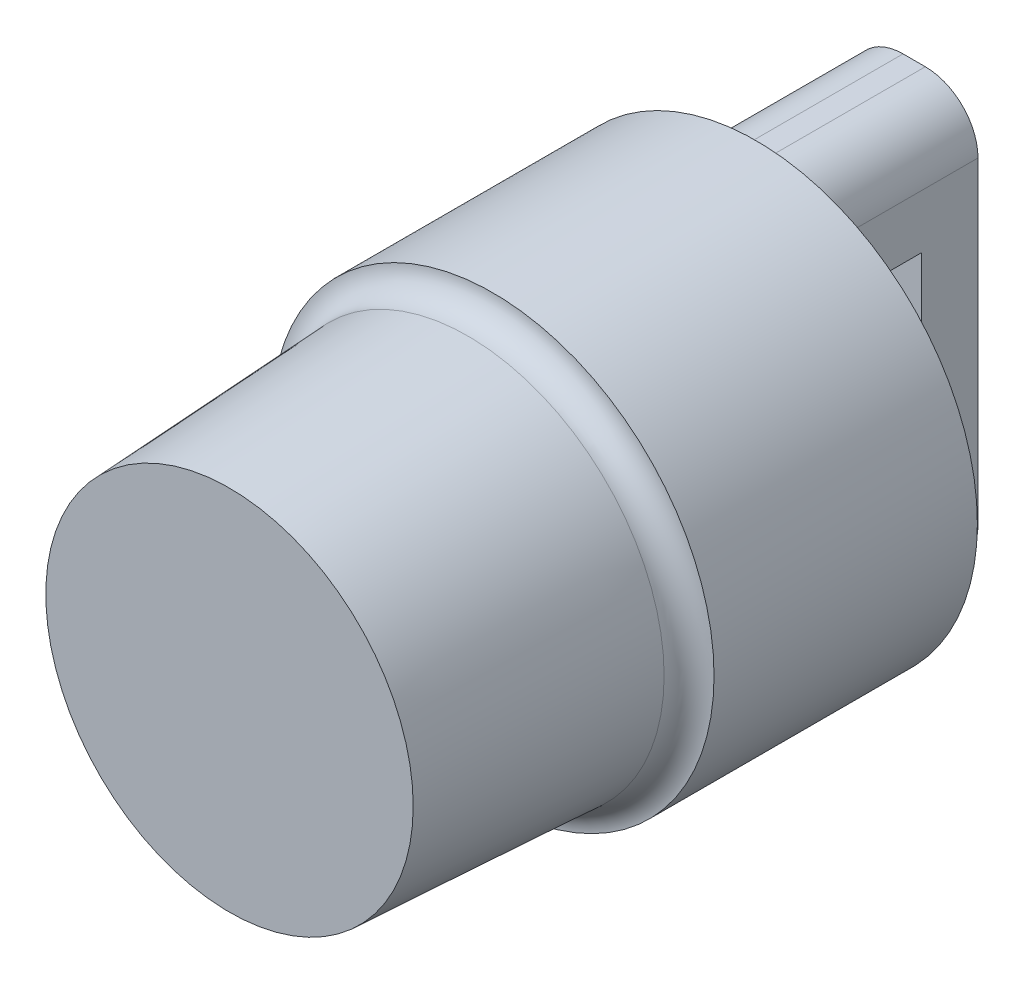
ISO-10303-21;
HEADER;
FILE_DESCRIPTION(('STEP AP214'),'2;1');
FILE_NAME('part.step','',(''),(''),'','','');
FILE_SCHEMA(('AUTOMOTIVE_DESIGN { 1 0 10303 214 1 1 1 1 }'));
ENDSEC;
DATA;
#1=APPLICATION_CONTEXT('core data for automotive mechanical design processes');
#2=APPLICATION_PROTOCOL_DEFINITION('international standard','automotive_design',2000,#1);
#3=PRODUCT_CONTEXT('',#1,'mechanical');
#4=PRODUCT('Part','Part','',(#3));
#5=PRODUCT_RELATED_PRODUCT_CATEGORY('part','',(#4));
#6=PRODUCT_DEFINITION_FORMATION('','',#4);
#7=PRODUCT_DEFINITION_CONTEXT('part definition',#1,'design');
#8=PRODUCT_DEFINITION('design','',#6,#7);
#9=PRODUCT_DEFINITION_SHAPE('','',#8);
#10=(LENGTH_UNIT() NAMED_UNIT(*) SI_UNIT(.MILLI.,.METRE.));
#11=(NAMED_UNIT(*) PLANE_ANGLE_UNIT() SI_UNIT($,.RADIAN.));
#12=(NAMED_UNIT(*) SI_UNIT($,.STERADIAN.) SOLID_ANGLE_UNIT());
#13=UNCERTAINTY_MEASURE_WITH_UNIT(LENGTH_MEASURE(1.E-05),#10,'distance_accuracy_value','');
#14=(GEOMETRIC_REPRESENTATION_CONTEXT(3) GLOBAL_UNCERTAINTY_ASSIGNED_CONTEXT((#13)) GLOBAL_UNIT_ASSIGNED_CONTEXT((#10,
#11,#12)) REPRESENTATION_CONTEXT('',''));
#15=CARTESIAN_POINT('',(0.,0.,0.));
#16=DIRECTION('',(0.,0.,1.));
#17=DIRECTION('',(1.,0.,0.));
#18=AXIS2_PLACEMENT_3D('',#15,#16,#17);
#19=CARTESIAN_POINT('',(0.,0.,0.));
#20=DIRECTION('',(0.,0.,1.));
#21=DIRECTION('',(1.,0.,0.));
#22=AXIS2_PLACEMENT_3D('',#19,#20,#21);
#23=PLANE('',#22);
#24=CARTESIAN_POINT('',(0.,0.,0.));
#25=DIRECTION('',(0.,0.,1.));
#26=DIRECTION('',(1.,0.,0.));
#27=AXIS2_PLACEMENT_3D('',#24,#25,#26);
#28=CIRCLE('',#27,8.4);
#29=CARTESIAN_POINT('',(2.4231137210634,8.04291737460943,0.));
#30=VERTEX_POINT('',#29);
#31=CARTESIAN_POINT('',(-2.4231137210634,8.04291737460943,0.));
#32=VERTEX_POINT('',#31);
#33=EDGE_CURVE('E192',#30,#32,#28,.T.);
#34=ORIENTED_EDGE('',*,*,#33,.F.);
#35=CARTESIAN_POINT('',(2.4231137210634,-8.04291737460943,0.));
#36=VERTEX_POINT('',#35);
#37=EDGE_CURVE('E187',#36,#30,#28,.T.);
#38=ORIENTED_EDGE('',*,*,#37,.F.);
#39=CARTESIAN_POINT('',(-2.4231137210634,-8.04291737460943,0.));
#40=VERTEX_POINT('',#39);
#41=EDGE_CURVE('E441',#40,#36,#28,.T.);
#42=ORIENTED_EDGE('',*,*,#41,.F.);
#43=EDGE_CURVE('E195',#32,#40,#28,.T.);
#44=ORIENTED_EDGE('',*,*,#43,.F.);
#45=EDGE_LOOP('',(#34,#38,#42,#44));
#46=FACE_BOUND('',#45,.T.);
#47=DIRECTION('',(1.,0.,0.));
#48=VECTOR('',#47,1.);
#49=CARTESIAN_POINT('',(2.4231137210634,8.04291737460943,0.));
#50=LINE('',#49,#48);
#51=CARTESIAN_POINT('',(-0.423113721063401,8.04291737460943,0.));
#52=VERTEX_POINT('',#51);
#53=CARTESIAN_POINT('',(0.423113721063401,8.04291737460943,0.));
#54=VERTEX_POINT('',#53);
#55=EDGE_CURVE('E180',#52,#54,#50,.T.);
#56=ORIENTED_EDGE('',*,*,#55,.F.);
#57=CARTESIAN_POINT('',(-0.423113721063401,6.04291737460943,0.));
#58=DIRECTION('',(0.,0.,1.));
#59=DIRECTION('',(1.,0.,0.));
#60=AXIS2_PLACEMENT_3D('',#57,#58,#59);
#61=CIRCLE('',#60,2.);
#62=CARTESIAN_POINT('',(-2.4231137210634,6.04291737460943,0.));
#63=VERTEX_POINT('',#62);
#64=EDGE_CURVE('E229',#52,#63,#61,.T.);
#65=ORIENTED_EDGE('',*,*,#64,.T.);
#66=DIRECTION('',(0.,1.,0.));
#67=VECTOR('',#66,1.);
#68=CARTESIAN_POINT('',(-2.4231137210634,8.04291737460943,0.));
#69=LINE('',#68,#67);
#70=CARTESIAN_POINT('',(-2.4231137210634,-6.04291737460943,0.));
#71=VERTEX_POINT('',#70);
#72=EDGE_CURVE('E162',#71,#63,#69,.T.);
#73=ORIENTED_EDGE('',*,*,#72,.F.);
#74=CARTESIAN_POINT('',(-0.423113721063401,-6.04291737460943,0.));
#75=DIRECTION('',(0.,0.,1.));
#76=DIRECTION('',(1.,0.,0.));
#77=AXIS2_PLACEMENT_3D('',#74,#75,#76);
#78=CIRCLE('',#77,2.);
#79=CARTESIAN_POINT('',(-0.423113721063401,-8.04291737460943,0.));
#80=VERTEX_POINT('',#79);
#81=EDGE_CURVE('E226',#71,#80,#78,.T.);
#82=ORIENTED_EDGE('',*,*,#81,.T.);
#83=DIRECTION('',(-1.,0.,0.));
#84=VECTOR('',#83,1.);
#85=CARTESIAN_POINT('',(2.4231137210634,-8.04291737460943,0.));
#86=LINE('',#85,#84);
#87=CARTESIAN_POINT('',(0.423113721063401,-8.04291737460943,0.));
#88=VERTEX_POINT('',#87);
#89=EDGE_CURVE('E169',#88,#80,#86,.T.);
#90=ORIENTED_EDGE('',*,*,#89,.F.);
#91=CARTESIAN_POINT('',(0.423113721063401,-6.04291737460943,0.));
#92=DIRECTION('',(0.,0.,1.));
#93=DIRECTION('',(1.,0.,0.));
#94=AXIS2_PLACEMENT_3D('',#91,#92,#93);
#95=CIRCLE('',#94,2.);
#96=CARTESIAN_POINT('',(2.4231137210634,-6.04291737460943,0.));
#97=VERTEX_POINT('',#96);
#98=EDGE_CURVE('E223',#88,#97,#95,.T.);
#99=ORIENTED_EDGE('',*,*,#98,.T.);
#100=DIRECTION('',(0.,-1.,0.));
#101=VECTOR('',#100,1.);
#102=CARTESIAN_POINT('',(2.4231137210634,8.04291737460943,0.));
#103=LINE('',#102,#101);
#104=CARTESIAN_POINT('',(2.4231137210634,6.04291737460943,0.));
#105=VERTEX_POINT('',#104);
#106=EDGE_CURVE('E182',#105,#97,#103,.T.);
#107=ORIENTED_EDGE('',*,*,#106,.F.);
#108=CARTESIAN_POINT('',(0.423113721063401,6.04291737460943,0.));
#109=DIRECTION('',(0.,0.,1.));
#110=DIRECTION('',(1.,0.,0.));
#111=AXIS2_PLACEMENT_3D('',#108,#109,#110);
#112=CIRCLE('',#111,2.);
#113=EDGE_CURVE('E232',#105,#54,#112,.T.);
#114=ORIENTED_EDGE('',*,*,#113,.T.);
#115=EDGE_LOOP('',(#56,#65,#73,#82,#90,#99,#107,#114));
#116=FACE_BOUND('',#115,.T.);
#117=ADVANCED_FACE('F35',(#46,#116),#23,.F.);
#118=CARTESIAN_POINT('',(0.,0.,10.));
#119=DIRECTION('',(0.,0.,-1.));
#120=DIRECTION('',(-1.,0.,0.));
#121=AXIS2_PLACEMENT_3D('',#118,#119,#120);
#122=CYLINDRICAL_SURFACE('',#121,8.4);
#123=CARTESIAN_POINT('',(0.,0.,10.));
#124=DIRECTION('',(0.,0.,1.));
#125=DIRECTION('',(1.,0.,0.));
#126=AXIS2_PLACEMENT_3D('',#123,#124,#125);
#127=CIRCLE('',#126,8.4);
#128=CARTESIAN_POINT('',(8.4,0.,10.));
#129=VERTEX_POINT('',#128);
#130=EDGE_CURVE('E188',#129,#129,#127,.T.);
#131=ORIENTED_EDGE('',*,*,#130,.F.);
#132=EDGE_LOOP('',(#131));
#133=FACE_BOUND('',#132,.T.);
#134=ORIENTED_EDGE('',*,*,#33,.T.);
#135=ORIENTED_EDGE('',*,*,#43,.T.);
#136=ORIENTED_EDGE('',*,*,#41,.T.);
#137=ORIENTED_EDGE('',*,*,#37,.T.);
#138=EDGE_LOOP('',(#134,#135,#136,#137));
#139=FACE_BOUND('',#138,.T.);
#140=ADVANCED_FACE('F260',(#133,#139),#122,.T.);
#141=CARTESIAN_POINT('',(0.,0.,10.));
#142=DIRECTION('',(0.,0.,-1.));
#143=DIRECTION('',(1.,0.,0.));
#144=AXIS2_PLACEMENT_3D('',#141,#142,#143);
#145=CONICAL_SURFACE('',#144,7.5,0.0523598775598299);
#146=CARTESIAN_POINT('',(0.,0.,10.9464614683213));
#147=DIRECTION('',(0.,0.,1.));
#148=DIRECTION('',(1.,0.,0.));
#149=AXIS2_PLACEMENT_3D('',#146,#147,#148);
#150=CIRCLE('',#149,7.45039805626832);
#151=CARTESIAN_POINT('',(7.45039805626832,0.,10.9464614683213));
#152=VERTEX_POINT('',#151);
#153=EDGE_CURVE('E235',#152,#152,#150,.T.);
#154=ORIENTED_EDGE('',*,*,#153,.T.);
#155=EDGE_LOOP('',(#154));
#156=FACE_BOUND('',#155,.T.);
#157=CARTESIAN_POINT('',(0.,0.,20.));
#158=DIRECTION('',(0.,0.,1.));
#159=DIRECTION('',(1.,0.,0.));
#160=AXIS2_PLACEMENT_3D('',#157,#158,#159);
#161=CIRCLE('',#160,6.97592220716959);
#162=CARTESIAN_POINT('',(6.97592220716959,0.,20.));
#163=VERTEX_POINT('',#162);
#164=EDGE_CURVE('E178',#163,#163,#161,.T.);
#165=ORIENTED_EDGE('',*,*,#164,.F.);
#166=EDGE_LOOP('',(#165));
#167=FACE_BOUND('',#166,.T.);
#168=ADVANCED_FACE('F266',(#156,#167),#145,.T.);
#169=CARTESIAN_POINT('',(0.,0.,20.));
#170=DIRECTION('',(0.,0.,1.));
#171=DIRECTION('',(1.,0.,0.));
#172=AXIS2_PLACEMENT_3D('',#169,#170,#171);
#173=PLANE('',#172);
#174=ORIENTED_EDGE('',*,*,#164,.T.);
#175=EDGE_LOOP('',(#174));
#176=FACE_BOUND('',#175,.T.);
#177=ADVANCED_FACE('F321',(#176),#173,.T.);
#178=CARTESIAN_POINT('',(-2.4231137210634,8.04291737460943,-6.));
#179=DIRECTION('',(1.,0.,0.));
#180=DIRECTION('',(0.,0.,-1.));
#181=AXIS2_PLACEMENT_3D('',#178,#179,#180);
#182=PLANE('',#181);
#183=DIRECTION('',(0.,0.,-1.));
#184=VECTOR('',#183,1.);
#185=CARTESIAN_POINT('',(-2.4231137210634,4.,-3.85980947138648));
#186=LINE('',#185,#184);
#187=CARTESIAN_POINT('',(-2.4231137210634,4.,-1.85980947138648));
#188=VERTEX_POINT('',#187);
#189=CARTESIAN_POINT('',(-2.4231137210634,4.,-3.85980947138648));
#190=VERTEX_POINT('',#189);
#191=EDGE_CURVE('E148',#188,#190,#186,.T.);
#192=ORIENTED_EDGE('',*,*,#191,.F.);
#193=DIRECTION('',(0.,1.,0.));
#194=VECTOR('',#193,1.);
#195=CARTESIAN_POINT('',(-2.4231137210634,4.,-1.85980947138648));
#196=LINE('',#195,#194);
#197=CARTESIAN_POINT('',(-2.4231137210634,-4.,-1.85980947138648));
#198=VERTEX_POINT('',#197);
#199=EDGE_CURVE('E50',#198,#188,#196,.T.);
#200=ORIENTED_EDGE('',*,*,#199,.F.);
#201=DIRECTION('',(0.,0.,1.));
#202=VECTOR('',#201,1.);
#203=CARTESIAN_POINT('',(-2.4231137210634,-4.,-3.85980947138648));
#204=LINE('',#203,#202);
#205=CARTESIAN_POINT('',(-2.4231137210634,-4.,-3.85980947138648));
#206=VERTEX_POINT('',#205);
#207=EDGE_CURVE('E155',#206,#198,#204,.T.);
#208=ORIENTED_EDGE('',*,*,#207,.F.);
#209=DIRECTION('',(0.,-1.,0.));
#210=VECTOR('',#209,1.);
#211=CARTESIAN_POINT('',(-2.4231137210634,4.,-3.85980947138648));
#212=LINE('',#211,#210);
#213=EDGE_CURVE('E139',#190,#206,#212,.T.);
#214=ORIENTED_EDGE('',*,*,#213,.F.);
#215=EDGE_LOOP('',(#192,#200,#208,#214));
#216=FACE_BOUND('',#215,.T.);
#217=DIRECTION('',(0.,1.,0.));
#218=VECTOR('',#217,1.);
#219=CARTESIAN_POINT('',(-2.4231137210634,8.04291737460943,-6.));
#220=LINE('',#219,#218);
#221=CARTESIAN_POINT('',(-2.4231137210634,-6.04291737460943,-6.));
#222=VERTEX_POINT('',#221);
#223=CARTESIAN_POINT('',(-2.4231137210634,6.04291737460943,-6.));
#224=VERTEX_POINT('',#223);
#225=EDGE_CURVE('E165',#222,#224,#220,.T.);
#226=ORIENTED_EDGE('',*,*,#225,.F.);
#227=DIRECTION('',(0.,0.,1.));
#228=VECTOR('',#227,1.);
#229=CARTESIAN_POINT('',(-2.4231137210634,-6.04291737460943,-6.));
#230=LINE('',#229,#228);
#231=EDGE_CURVE('E215',#222,#71,#230,.T.);
#232=ORIENTED_EDGE('',*,*,#231,.T.);
#233=ORIENTED_EDGE('',*,*,#72,.T.);
#234=DIRECTION('',(0.,0.,1.));
#235=VECTOR('',#234,1.);
#236=CARTESIAN_POINT('',(-2.4231137210634,6.04291737460943,-6.));
#237=LINE('',#236,#235);
#238=EDGE_CURVE('E213',#63,#224,#237,.F.);
#239=ORIENTED_EDGE('',*,*,#238,.T.);
#240=EDGE_LOOP('',(#226,#232,#233,#239));
#241=FACE_BOUND('',#240,.T.);
#242=ADVANCED_FACE('F152',(#216,#241),#182,.F.);
#243=CARTESIAN_POINT('',(2.4231137210634,8.04291737460943,-6.));
#244=DIRECTION('',(0.,-1.,0.));
#245=DIRECTION('',(0.,0.,-1.));
#246=AXIS2_PLACEMENT_3D('',#243,#244,#245);
#247=PLANE('',#246);
#248=DIRECTION('',(1.,0.,0.));
#249=VECTOR('',#248,1.);
#250=CARTESIAN_POINT('',(2.4231137210634,8.04291737460943,-6.));
#251=LINE('',#250,#249);
#252=CARTESIAN_POINT('',(-0.423113721063401,8.04291737460943,-6.));
#253=VERTEX_POINT('',#252);
#254=CARTESIAN_POINT('',(0.423113721063401,8.04291737460943,-6.));
#255=VERTEX_POINT('',#254);
#256=EDGE_CURVE('E168',#253,#255,#251,.T.);
#257=ORIENTED_EDGE('',*,*,#256,.F.);
#258=DIRECTION('',(0.,0.,1.));
#259=VECTOR('',#258,1.);
#260=CARTESIAN_POINT('',(-0.423113721063401,8.04291737460943,-6.));
#261=LINE('',#260,#259);
#262=EDGE_CURVE('E220',#253,#52,#261,.T.);
#263=ORIENTED_EDGE('',*,*,#262,.T.);
#264=ORIENTED_EDGE('',*,*,#55,.T.);
#265=DIRECTION('',(0.,0.,1.));
#266=VECTOR('',#265,1.);
#267=CARTESIAN_POINT('',(0.423113721063401,8.04291737460943,-6.));
#268=LINE('',#267,#266);
#269=EDGE_CURVE('E218',#54,#255,#268,.F.);
#270=ORIENTED_EDGE('',*,*,#269,.T.);
#271=EDGE_LOOP('',(#257,#263,#264,#270));
#272=FACE_BOUND('',#271,.T.);
#273=ADVANCED_FACE('F312',(#272),#247,.F.);
#274=CARTESIAN_POINT('',(2.4231137210634,8.04291737460943,-6.));
#275=DIRECTION('',(-1.,0.,0.));
#276=DIRECTION('',(0.,0.,1.));
#277=AXIS2_PLACEMENT_3D('',#274,#275,#276);
#278=PLANE('',#277);
#279=DIRECTION('',(0.,0.,1.));
#280=VECTOR('',#279,1.);
#281=CARTESIAN_POINT('',(2.4231137210634,-4.,-5.99999999999999));
#282=LINE('',#281,#280);
#283=CARTESIAN_POINT('',(2.4231137210634,-4.,-3.85980947138648));
#284=VERTEX_POINT('',#283);
#285=CARTESIAN_POINT('',(2.4231137210634,-4.,-1.85980947138648));
#286=VERTEX_POINT('',#285);
#287=EDGE_CURVE('E43',#284,#286,#282,.T.);
#288=ORIENTED_EDGE('',*,*,#287,.T.);
#289=DIRECTION('',(0.,1.,0.));
#290=VECTOR('',#289,1.);
#291=CARTESIAN_POINT('',(2.4231137210634,8.04291737460944,-1.85980947138648));
#292=LINE('',#291,#290);
#293=CARTESIAN_POINT('',(2.4231137210634,4.,-1.85980947138648));
#294=VERTEX_POINT('',#293);
#295=EDGE_CURVE('E11',#286,#294,#292,.T.);
#296=ORIENTED_EDGE('',*,*,#295,.T.);
#297=DIRECTION('',(0.,0.,-1.));
#298=VECTOR('',#297,1.);
#299=CARTESIAN_POINT('',(2.4231137210634,4.,-6.));
#300=LINE('',#299,#298);
#301=CARTESIAN_POINT('',(2.4231137210634,4.,-3.85980947138648));
#302=VERTEX_POINT('',#301);
#303=EDGE_CURVE('E238',#294,#302,#300,.T.);
#304=ORIENTED_EDGE('',*,*,#303,.T.);
#305=DIRECTION('',(0.,-1.,0.));
#306=VECTOR('',#305,1.);
#307=CARTESIAN_POINT('',(2.4231137210634,8.04291737460943,-3.85980947138648));
#308=LINE('',#307,#306);
#309=EDGE_CURVE('E142',#302,#284,#308,.T.);
#310=ORIENTED_EDGE('',*,*,#309,.T.);
#311=EDGE_LOOP('',(#288,#296,#304,#310));
#312=FACE_BOUND('',#311,.T.);
#313=ORIENTED_EDGE('',*,*,#106,.T.);
#314=DIRECTION('',(0.,0.,1.));
#315=VECTOR('',#314,1.);
#316=CARTESIAN_POINT('',(2.4231137210634,-6.04291737460943,-6.));
#317=LINE('',#316,#315);
#318=CARTESIAN_POINT('',(2.4231137210634,-6.04291737460943,-6.));
#319=VERTEX_POINT('',#318);
#320=EDGE_CURVE('E203',#97,#319,#317,.F.);
#321=ORIENTED_EDGE('',*,*,#320,.T.);
#322=DIRECTION('',(0.,-1.,0.));
#323=VECTOR('',#322,1.);
#324=CARTESIAN_POINT('',(2.4231137210634,8.04291737460943,-6.));
#325=LINE('',#324,#323);
#326=CARTESIAN_POINT('',(2.4231137210634,6.04291737460943,-6.));
#327=VERTEX_POINT('',#326);
#328=EDGE_CURVE('E172',#327,#319,#325,.T.);
#329=ORIENTED_EDGE('',*,*,#328,.F.);
#330=DIRECTION('',(0.,0.,1.));
#331=VECTOR('',#330,1.);
#332=CARTESIAN_POINT('',(2.4231137210634,6.04291737460943,-6.));
#333=LINE('',#332,#331);
#334=EDGE_CURVE('E200',#327,#105,#333,.T.);
#335=ORIENTED_EDGE('',*,*,#334,.T.);
#336=EDGE_LOOP('',(#313,#321,#329,#335));
#337=FACE_BOUND('',#336,.T.);
#338=ADVANCED_FACE('F242',(#312,#337),#278,.F.);
#339=CARTESIAN_POINT('',(2.4231137210634,-8.04291737460943,-6.));
#340=DIRECTION('',(0.,1.,0.));
#341=DIRECTION('',(0.,0.,1.));
#342=AXIS2_PLACEMENT_3D('',#339,#340,#341);
#343=PLANE('',#342);
#344=DIRECTION('',(-1.,0.,0.));
#345=VECTOR('',#344,1.);
#346=CARTESIAN_POINT('',(2.4231137210634,-8.04291737460943,-6.));
#347=LINE('',#346,#345);
#348=CARTESIAN_POINT('',(0.423113721063401,-8.04291737460943,-6.));
#349=VERTEX_POINT('',#348);
#350=CARTESIAN_POINT('',(-0.423113721063401,-8.04291737460943,-6.));
#351=VERTEX_POINT('',#350);
#352=EDGE_CURVE('E175',#349,#351,#347,.T.);
#353=ORIENTED_EDGE('',*,*,#352,.F.);
#354=DIRECTION('',(0.,0.,1.));
#355=VECTOR('',#354,1.);
#356=CARTESIAN_POINT('',(0.423113721063401,-8.04291737460943,-6.));
#357=LINE('',#356,#355);
#358=EDGE_CURVE('E197',#349,#88,#357,.T.);
#359=ORIENTED_EDGE('',*,*,#358,.T.);
#360=ORIENTED_EDGE('',*,*,#89,.T.);
#361=DIRECTION('',(0.,0.,1.));
#362=VECTOR('',#361,1.);
#363=CARTESIAN_POINT('',(-0.423113721063401,-8.04291737460943,-6.));
#364=LINE('',#363,#362);
#365=EDGE_CURVE('E191',#80,#351,#364,.F.);
#366=ORIENTED_EDGE('',*,*,#365,.T.);
#367=EDGE_LOOP('',(#353,#359,#360,#366));
#368=FACE_BOUND('',#367,.T.);
#369=ADVANCED_FACE('F302',(#368),#343,.F.);
#370=CARTESIAN_POINT('',(0.,0.,-6.));
#371=DIRECTION('',(0.,0.,-1.));
#372=DIRECTION('',(-1.,0.,0.));
#373=AXIS2_PLACEMENT_3D('',#370,#371,#372);
#374=PLANE('',#373);
#375=ORIENTED_EDGE('',*,*,#328,.T.);
#376=CARTESIAN_POINT('',(0.423113721063401,-6.04291737460943,-6.));
#377=DIRECTION('',(0.,0.,-1.));
#378=DIRECTION('',(-1.,0.,0.));
#379=AXIS2_PLACEMENT_3D('',#376,#377,#378);
#380=CIRCLE('',#379,2.);
#381=EDGE_CURVE('E211',#319,#349,#380,.T.);
#382=ORIENTED_EDGE('',*,*,#381,.T.);
#383=ORIENTED_EDGE('',*,*,#352,.T.);
#384=CARTESIAN_POINT('',(-0.423113721063401,-6.04291737460943,-6.));
#385=DIRECTION('',(0.,0.,-1.));
#386=DIRECTION('',(-1.,0.,0.));
#387=AXIS2_PLACEMENT_3D('',#384,#385,#386);
#388=CIRCLE('',#387,2.);
#389=EDGE_CURVE('E209',#351,#222,#388,.T.);
#390=ORIENTED_EDGE('',*,*,#389,.T.);
#391=ORIENTED_EDGE('',*,*,#225,.T.);
#392=CARTESIAN_POINT('',(-0.423113721063401,6.04291737460943,-6.));
#393=DIRECTION('',(0.,0.,-1.));
#394=DIRECTION('',(-1.,0.,0.));
#395=AXIS2_PLACEMENT_3D('',#392,#393,#394);
#396=CIRCLE('',#395,2.);
#397=EDGE_CURVE('E207',#224,#253,#396,.T.);
#398=ORIENTED_EDGE('',*,*,#397,.T.);
#399=ORIENTED_EDGE('',*,*,#256,.T.);
#400=CARTESIAN_POINT('',(0.423113721063401,6.04291737460943,-6.));
#401=DIRECTION('',(0.,0.,-1.));
#402=DIRECTION('',(-1.,0.,0.));
#403=AXIS2_PLACEMENT_3D('',#400,#401,#402);
#404=CIRCLE('',#403,2.);
#405=EDGE_CURVE('E205',#255,#327,#404,.T.);
#406=ORIENTED_EDGE('',*,*,#405,.T.);
#407=EDGE_LOOP('',(#375,#382,#383,#390,#391,#398,#399,#406));
#408=FACE_BOUND('',#407,.T.);
#409=ADVANCED_FACE('F277',(#408),#374,.T.);
#410=CARTESIAN_POINT('',(0.423113721063401,-6.04291737460943,-6.));
#411=DIRECTION('',(0.,0.,1.));
#412=DIRECTION('',(1.,0.,0.));
#413=AXIS2_PLACEMENT_3D('',#410,#411,#412);
#414=CYLINDRICAL_SURFACE('',#413,2.);
#415=ORIENTED_EDGE('',*,*,#381,.F.);
#416=ORIENTED_EDGE('',*,*,#320,.F.);
#417=ORIENTED_EDGE('',*,*,#98,.F.);
#418=ORIENTED_EDGE('',*,*,#358,.F.);
#419=EDGE_LOOP('',(#415,#416,#417,#418));
#420=FACE_BOUND('',#419,.T.);
#421=ADVANCED_FACE('F273',(#420),#414,.T.);
#422=CARTESIAN_POINT('',(-0.423113721063401,-6.04291737460943,-6.));
#423=DIRECTION('',(0.,0.,1.));
#424=DIRECTION('',(1.,0.,0.));
#425=AXIS2_PLACEMENT_3D('',#422,#423,#424);
#426=CYLINDRICAL_SURFACE('',#425,2.);
#427=ORIENTED_EDGE('',*,*,#389,.F.);
#428=ORIENTED_EDGE('',*,*,#365,.F.);
#429=ORIENTED_EDGE('',*,*,#81,.F.);
#430=ORIENTED_EDGE('',*,*,#231,.F.);
#431=EDGE_LOOP('',(#427,#428,#429,#430));
#432=FACE_BOUND('',#431,.T.);
#433=ADVANCED_FACE('F276',(#432),#426,.T.);
#434=CARTESIAN_POINT('',(-0.423113721063401,6.04291737460943,-6.));
#435=DIRECTION('',(0.,0.,1.));
#436=DIRECTION('',(1.,0.,0.));
#437=AXIS2_PLACEMENT_3D('',#434,#435,#436);
#438=CYLINDRICAL_SURFACE('',#437,2.);
#439=ORIENTED_EDGE('',*,*,#397,.F.);
#440=ORIENTED_EDGE('',*,*,#238,.F.);
#441=ORIENTED_EDGE('',*,*,#64,.F.);
#442=ORIENTED_EDGE('',*,*,#262,.F.);
#443=EDGE_LOOP('',(#439,#440,#441,#442));
#444=FACE_BOUND('',#443,.T.);
#445=ADVANCED_FACE('F281',(#444),#438,.T.);
#446=CARTESIAN_POINT('',(0.423113721063401,6.04291737460943,-6.));
#447=DIRECTION('',(0.,0.,1.));
#448=DIRECTION('',(1.,0.,0.));
#449=AXIS2_PLACEMENT_3D('',#446,#447,#448);
#450=CYLINDRICAL_SURFACE('',#449,2.);
#451=ORIENTED_EDGE('',*,*,#405,.F.);
#452=ORIENTED_EDGE('',*,*,#269,.F.);
#453=ORIENTED_EDGE('',*,*,#113,.F.);
#454=ORIENTED_EDGE('',*,*,#334,.F.);
#455=EDGE_LOOP('',(#451,#452,#453,#454));
#456=FACE_BOUND('',#455,.T.);
#457=ADVANCED_FACE('F255',(#456),#450,.T.);
#458=CARTESIAN_POINT('',(0.,0.,10.9987974245642));
#459=DIRECTION('',(0.,0.,-1.));
#460=DIRECTION('',(-1.,0.,0.));
#461=AXIS2_PLACEMENT_3D('',#458,#459,#460);
#462=TOROIDAL_SURFACE('',#461,8.44902759102289,1.);
#463=ORIENTED_EDGE('',*,*,#130,.T.);
#464=EDGE_LOOP('',(#463));
#465=FACE_BOUND('',#464,.T.);
#466=ORIENTED_EDGE('',*,*,#153,.F.);
#467=EDGE_LOOP('',(#466));
#468=FACE_BOUND('',#467,.T.);
#469=ADVANCED_FACE('F37',(#465,#468),#462,.F.);
#470=CARTESIAN_POINT('',(8.4,4.,-1.85980947138648));
#471=DIRECTION('',(0.,0.,1.));
#472=DIRECTION('',(0.,-1.,0.));
#473=AXIS2_PLACEMENT_3D('',#470,#471,#472);
#474=PLANE('',#473);
#475=DIRECTION('',(-1.,0.,0.));
#476=VECTOR('',#475,1.);
#477=CARTESIAN_POINT('',(8.4,-4.,-1.85980947138648));
#478=LINE('',#477,#476);
#479=EDGE_CURVE('E160',#286,#198,#478,.T.);
#480=ORIENTED_EDGE('',*,*,#479,.T.);
#481=ORIENTED_EDGE('',*,*,#199,.T.);
#482=DIRECTION('',(-1.,0.,0.));
#483=VECTOR('',#482,1.);
#484=CARTESIAN_POINT('',(8.4,4.,-1.85980947138648));
#485=LINE('',#484,#483);
#486=EDGE_CURVE('E145',#294,#188,#485,.T.);
#487=ORIENTED_EDGE('',*,*,#486,.F.);
#488=ORIENTED_EDGE('',*,*,#295,.F.);
#489=EDGE_LOOP('',(#480,#481,#487,#488));
#490=FACE_BOUND('',#489,.T.);
#491=ADVANCED_FACE('F247',(#490),#474,.F.);
#492=CARTESIAN_POINT('',(8.4,-4.,-3.85980947138648));
#493=DIRECTION('',(0.,-1.,0.));
#494=DIRECTION('',(0.,0.,-1.));
#495=AXIS2_PLACEMENT_3D('',#492,#493,#494);
#496=PLANE('',#495);
#497=DIRECTION('',(-1.,0.,0.));
#498=VECTOR('',#497,1.);
#499=CARTESIAN_POINT('',(8.4,-4.,-3.85980947138648));
#500=LINE('',#499,#498);
#501=EDGE_CURVE('E144',#284,#206,#500,.T.);
#502=ORIENTED_EDGE('',*,*,#501,.T.);
#503=ORIENTED_EDGE('',*,*,#207,.T.);
#504=ORIENTED_EDGE('',*,*,#479,.F.);
#505=ORIENTED_EDGE('',*,*,#287,.F.);
#506=EDGE_LOOP('',(#502,#503,#504,#505));
#507=FACE_BOUND('',#506,.T.);
#508=ADVANCED_FACE('F246',(#507),#496,.F.);
#509=CARTESIAN_POINT('',(8.4,4.,-3.85980947138648));
#510=DIRECTION('',(0.,0.,-1.));
#511=DIRECTION('',(-1.,0.,0.));
#512=AXIS2_PLACEMENT_3D('',#509,#510,#511);
#513=PLANE('',#512);
#514=DIRECTION('',(-1.,0.,0.));
#515=VECTOR('',#514,1.);
#516=CARTESIAN_POINT('',(8.4,4.,-3.85980947138648));
#517=LINE('',#516,#515);
#518=EDGE_CURVE('E58',#302,#190,#517,.T.);
#519=ORIENTED_EDGE('',*,*,#518,.T.);
#520=ORIENTED_EDGE('',*,*,#213,.T.);
#521=ORIENTED_EDGE('',*,*,#501,.F.);
#522=ORIENTED_EDGE('',*,*,#309,.F.);
#523=EDGE_LOOP('',(#519,#520,#521,#522));
#524=FACE_BOUND('',#523,.T.);
#525=ADVANCED_FACE('F136',(#524),#513,.F.);
#526=CARTESIAN_POINT('',(8.4,4.,-3.85980947138648));
#527=DIRECTION('',(0.,1.,0.));
#528=DIRECTION('',(0.,0.,1.));
#529=AXIS2_PLACEMENT_3D('',#526,#527,#528);
#530=PLANE('',#529);
#531=ORIENTED_EDGE('',*,*,#486,.T.);
#532=ORIENTED_EDGE('',*,*,#191,.T.);
#533=ORIENTED_EDGE('',*,*,#518,.F.);
#534=ORIENTED_EDGE('',*,*,#303,.F.);
#535=EDGE_LOOP('',(#531,#532,#533,#534));
#536=FACE_BOUND('',#535,.T.);
#537=ADVANCED_FACE('F149',(#536),#530,.F.);
#538=CLOSED_SHELL('',(#117,#140,#168,#177,#242,#273,#338,#369,#409,#421,#433,#445,#457,#469,
#491,#508,#525,#537));
#539=MANIFOLD_SOLID_BREP('B2',#538);
#540=ADVANCED_BREP_SHAPE_REPRESENTATION('',(#18,#539),#14);
#541=SHAPE_DEFINITION_REPRESENTATION(#9,#540);
ENDSEC;
END-ISO-10303-21;
